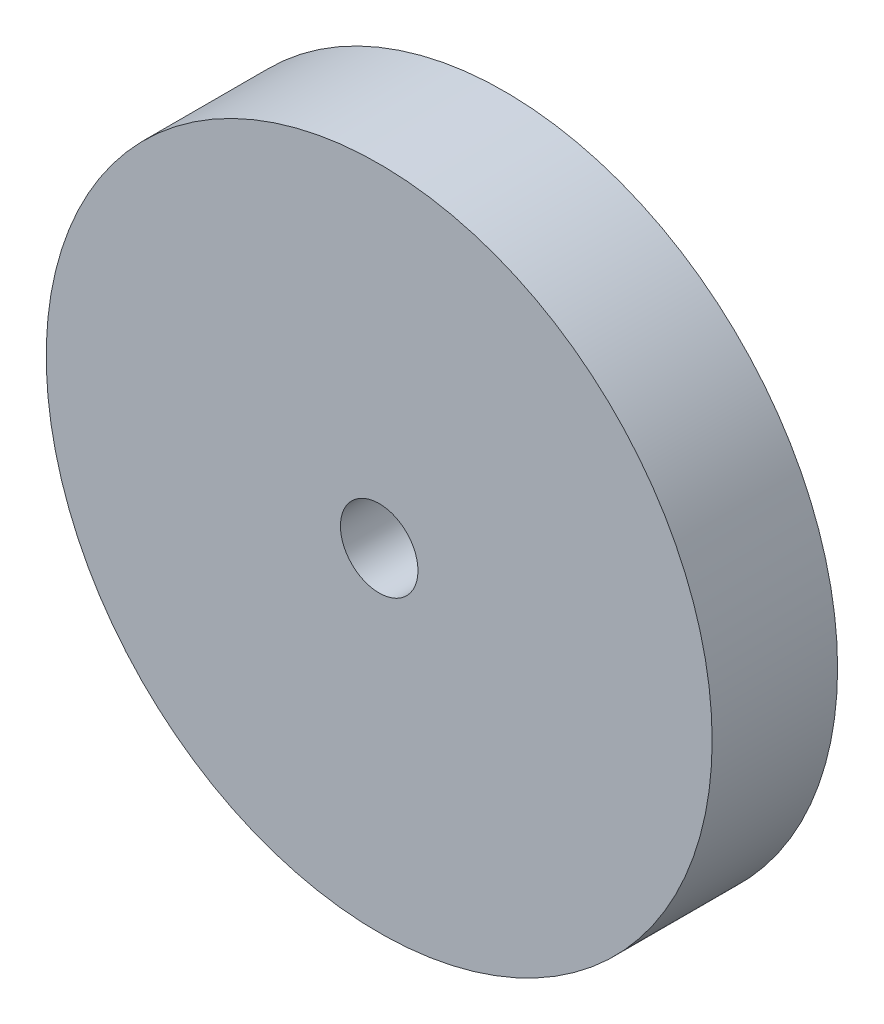
ISO-10303-21;
HEADER;
FILE_DESCRIPTION(('STEP AP214'),'2;1');
FILE_NAME('part.step','',(''),(''),'','','');
FILE_SCHEMA(('AUTOMOTIVE_DESIGN { 1 0 10303 214 1 1 1 1 }'));
ENDSEC;
DATA;
#1=APPLICATION_CONTEXT('core data for automotive mechanical design processes');
#2=APPLICATION_PROTOCOL_DEFINITION('international standard','automotive_design',2000,#1);
#3=PRODUCT_CONTEXT('',#1,'mechanical');
#4=PRODUCT('Part','Part','',(#3));
#5=PRODUCT_RELATED_PRODUCT_CATEGORY('part','',(#4));
#6=PRODUCT_DEFINITION_FORMATION('','',#4);
#7=PRODUCT_DEFINITION_CONTEXT('part definition',#1,'design');
#8=PRODUCT_DEFINITION('design','',#6,#7);
#9=PRODUCT_DEFINITION_SHAPE('','',#8);
#10=(LENGTH_UNIT() NAMED_UNIT(*) SI_UNIT(.MILLI.,.METRE.));
#11=(NAMED_UNIT(*) PLANE_ANGLE_UNIT() SI_UNIT($,.RADIAN.));
#12=(NAMED_UNIT(*) SI_UNIT($,.STERADIAN.) SOLID_ANGLE_UNIT());
#13=UNCERTAINTY_MEASURE_WITH_UNIT(LENGTH_MEASURE(1.E-05),#10,'distance_accuracy_value','');
#14=(GEOMETRIC_REPRESENTATION_CONTEXT(3) GLOBAL_UNCERTAINTY_ASSIGNED_CONTEXT((#13)) GLOBAL_UNIT_ASSIGNED_CONTEXT((#10,
#11,#12)) REPRESENTATION_CONTEXT('',''));
#15=CARTESIAN_POINT('',(0.,0.,0.));
#16=DIRECTION('',(0.,0.,1.));
#17=DIRECTION('',(1.,0.,0.));
#18=AXIS2_PLACEMENT_3D('',#15,#16,#17);
#19=CARTESIAN_POINT('',(0.,0.,13.75));
#20=DIRECTION('',(0.,0.,1.));
#21=DIRECTION('',(1.,0.,0.));
#22=AXIS2_PLACEMENT_3D('',#19,#20,#21);
#23=PLANE('',#22);
#24=CARTESIAN_POINT('',(0.,0.,13.75));
#25=DIRECTION('',(0.,0.,1.));
#26=DIRECTION('',(1.,0.,0.));
#27=AXIS2_PLACEMENT_3D('',#24,#25,#26);
#28=CIRCLE('',#27,36.5);
#29=CARTESIAN_POINT('',(36.5,0.,13.75));
#30=VERTEX_POINT('',#29);
#31=EDGE_CURVE('E10',#30,#30,#28,.T.);
#32=ORIENTED_EDGE('',*,*,#31,.T.);
#33=EDGE_LOOP('',(#32));
#34=FACE_BOUND('',#33,.T.);
#35=CARTESIAN_POINT('',(0.,0.,13.75));
#36=DIRECTION('',(0.,0.,1.));
#37=DIRECTION('',(1.,0.,0.));
#38=AXIS2_PLACEMENT_3D('',#35,#36,#37);
#39=CIRCLE('',#38,4.25);
#40=CARTESIAN_POINT('',(4.25,0.,13.75));
#41=VERTEX_POINT('',#40);
#42=EDGE_CURVE('E42',#41,#41,#39,.T.);
#43=ORIENTED_EDGE('',*,*,#42,.F.);
#44=EDGE_LOOP('',(#43));
#45=FACE_BOUND('',#44,.T.);
#46=ADVANCED_FACE('F31',(#34,#45),#23,.T.);
#47=CARTESIAN_POINT('',(0.,0.,0.));
#48=DIRECTION('',(0.,0.,1.));
#49=DIRECTION('',(1.,0.,0.));
#50=AXIS2_PLACEMENT_3D('',#47,#48,#49);
#51=PLANE('',#50);
#52=CARTESIAN_POINT('',(0.,0.,0.));
#53=DIRECTION('',(0.,0.,1.));
#54=DIRECTION('',(1.,0.,0.));
#55=AXIS2_PLACEMENT_3D('',#52,#53,#54);
#56=CIRCLE('',#55,36.5);
#57=CARTESIAN_POINT('',(36.5,0.,0.));
#58=VERTEX_POINT('',#57);
#59=EDGE_CURVE('E35',#58,#58,#56,.T.);
#60=ORIENTED_EDGE('',*,*,#59,.F.);
#61=EDGE_LOOP('',(#60));
#62=FACE_BOUND('',#61,.T.);
#63=CARTESIAN_POINT('',(0.,0.,0.));
#64=DIRECTION('',(0.,0.,1.));
#65=DIRECTION('',(1.,0.,0.));
#66=AXIS2_PLACEMENT_3D('',#63,#64,#65);
#67=CIRCLE('',#66,4.25);
#68=CARTESIAN_POINT('',(4.25,0.,0.));
#69=VERTEX_POINT('',#68);
#70=EDGE_CURVE('E44',#69,#69,#67,.T.);
#71=ORIENTED_EDGE('',*,*,#70,.T.);
#72=EDGE_LOOP('',(#71));
#73=FACE_BOUND('',#72,.T.);
#74=ADVANCED_FACE('F54',(#62,#73),#51,.F.);
#75=CARTESIAN_POINT('',(0.,0.,13.75));
#76=DIRECTION('',(0.,0.,-1.));
#77=DIRECTION('',(-1.,0.,0.));
#78=AXIS2_PLACEMENT_3D('',#75,#76,#77);
#79=CYLINDRICAL_SURFACE('',#78,36.5);
#80=ORIENTED_EDGE('',*,*,#31,.F.);
#81=EDGE_LOOP('',(#80));
#82=FACE_BOUND('',#81,.T.);
#83=ORIENTED_EDGE('',*,*,#59,.T.);
#84=EDGE_LOOP('',(#83));
#85=FACE_BOUND('',#84,.T.);
#86=ADVANCED_FACE('F33',(#82,#85),#79,.T.);
#87=CARTESIAN_POINT('',(0.,0.,13.75));
#88=DIRECTION('',(0.,0.,-1.));
#89=DIRECTION('',(-1.,0.,0.));
#90=AXIS2_PLACEMENT_3D('',#87,#88,#89);
#91=CYLINDRICAL_SURFACE('',#90,4.25);
#92=ORIENTED_EDGE('',*,*,#42,.T.);
#93=EDGE_LOOP('',(#92));
#94=FACE_BOUND('',#93,.T.);
#95=ORIENTED_EDGE('',*,*,#70,.F.);
#96=EDGE_LOOP('',(#95));
#97=FACE_BOUND('',#96,.T.);
#98=ADVANCED_FACE('F50',(#94,#97),#91,.F.);
#99=CLOSED_SHELL('',(#46,#74,#86,#98));
#100=MANIFOLD_SOLID_BREP('B2',#99);
#101=ADVANCED_BREP_SHAPE_REPRESENTATION('',(#18,#100),#14);
#102=SHAPE_DEFINITION_REPRESENTATION(#9,#101);
ENDSEC;
END-ISO-10303-21;
